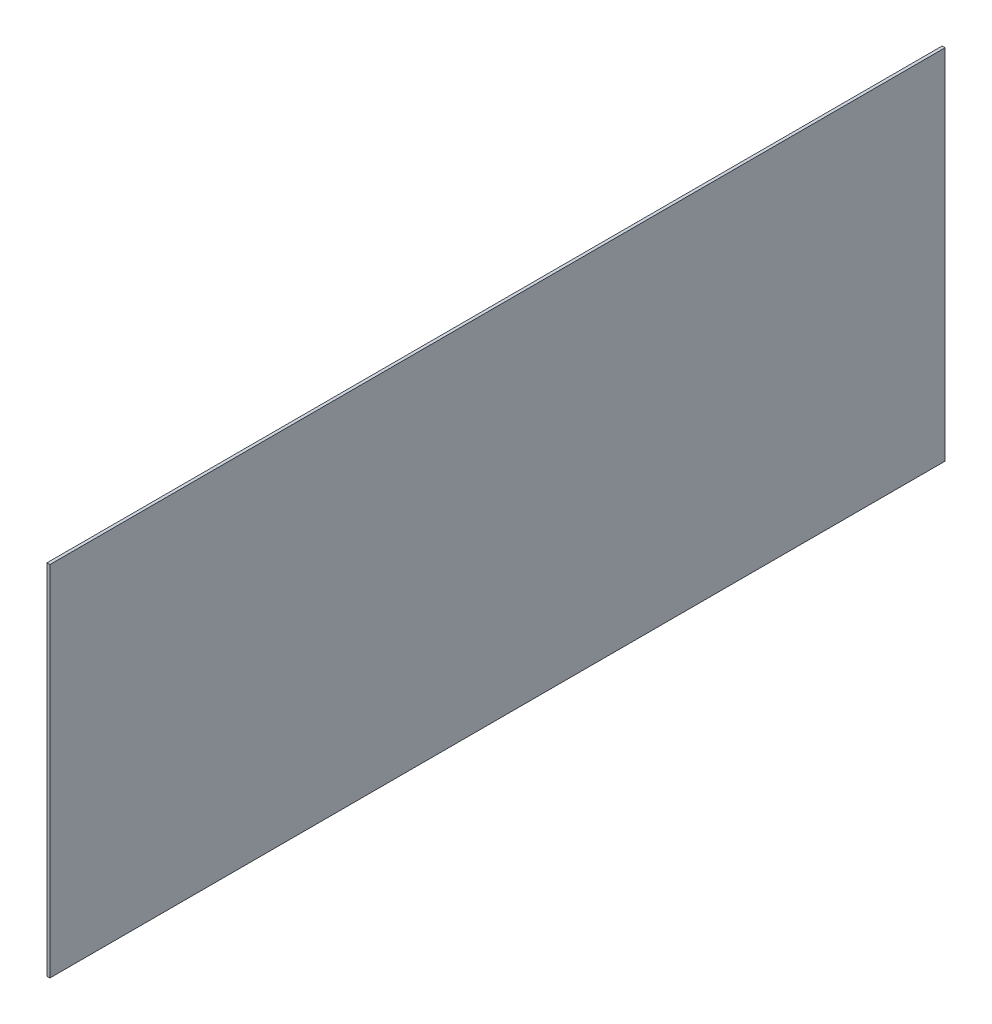
ISO-10303-21;
HEADER;
FILE_DESCRIPTION(('STEP AP214'),'2;1');
FILE_NAME('part.step','',(''),(''),'','','');
FILE_SCHEMA(('AUTOMOTIVE_DESIGN { 1 0 10303 214 1 1 1 1 }'));
ENDSEC;
DATA;
#1=APPLICATION_CONTEXT('core data for automotive mechanical design processes');
#2=APPLICATION_PROTOCOL_DEFINITION('international standard','automotive_design',2000,#1);
#3=PRODUCT_CONTEXT('',#1,'mechanical');
#4=PRODUCT('Part','Part','',(#3));
#5=PRODUCT_RELATED_PRODUCT_CATEGORY('part','',(#4));
#6=PRODUCT_DEFINITION_FORMATION('','',#4);
#7=PRODUCT_DEFINITION_CONTEXT('part definition',#1,'design');
#8=PRODUCT_DEFINITION('design','',#6,#7);
#9=PRODUCT_DEFINITION_SHAPE('','',#8);
#10=(LENGTH_UNIT() NAMED_UNIT(*) SI_UNIT(.MILLI.,.METRE.));
#11=(NAMED_UNIT(*) PLANE_ANGLE_UNIT() SI_UNIT($,.RADIAN.));
#12=(NAMED_UNIT(*) SI_UNIT($,.STERADIAN.) SOLID_ANGLE_UNIT());
#13=UNCERTAINTY_MEASURE_WITH_UNIT(LENGTH_MEASURE(1.E-05),#10,'distance_accuracy_value','');
#14=(GEOMETRIC_REPRESENTATION_CONTEXT(3) GLOBAL_UNCERTAINTY_ASSIGNED_CONTEXT((#13)) GLOBAL_UNIT_ASSIGNED_CONTEXT((#10,
#11,#12)) REPRESENTATION_CONTEXT('',''));
#15=CARTESIAN_POINT('',(0.,0.,0.));
#16=DIRECTION('',(0.,0.,1.));
#17=DIRECTION('',(1.,0.,0.));
#18=AXIS2_PLACEMENT_3D('',#15,#16,#17);
#19=CARTESIAN_POINT('',(-126.,-60.,150.));
#20=DIRECTION('',(0.,0.,1.));
#21=DIRECTION('',(0.,-1.,0.));
#22=AXIS2_PLACEMENT_3D('',#19,#20,#21);
#23=PLANE('',#22);
#24=DIRECTION('',(0.,-1.,0.));
#25=VECTOR('',#24,1.);
#26=CARTESIAN_POINT('',(-125.,-60.,150.));
#27=LINE('',#26,#25);
#28=CARTESIAN_POINT('',(-125.,60.,150.));
#29=VERTEX_POINT('',#28);
#30=CARTESIAN_POINT('',(-125.,-60.,150.));
#31=VERTEX_POINT('',#30);
#32=EDGE_CURVE('E115',#29,#31,#27,.T.);
#33=ORIENTED_EDGE('',*,*,#32,.F.);
#34=DIRECTION('',(1.,0.,0.));
#35=VECTOR('',#34,1.);
#36=CARTESIAN_POINT('',(-126.,60.,150.));
#37=LINE('',#36,#35);
#38=CARTESIAN_POINT('',(-126.,60.,150.));
#39=VERTEX_POINT('',#38);
#40=EDGE_CURVE('E11',#39,#29,#37,.T.);
#41=ORIENTED_EDGE('',*,*,#40,.F.);
#42=DIRECTION('',(0.,-1.,0.));
#43=VECTOR('',#42,1.);
#44=CARTESIAN_POINT('',(-126.,-60.,150.));
#45=LINE('',#44,#43);
#46=CARTESIAN_POINT('',(-126.,-60.,150.));
#47=VERTEX_POINT('',#46);
#48=EDGE_CURVE('E107',#39,#47,#45,.T.);
#49=ORIENTED_EDGE('',*,*,#48,.T.);
#50=DIRECTION('',(1.,0.,0.));
#51=VECTOR('',#50,1.);
#52=CARTESIAN_POINT('',(-126.,-60.,150.));
#53=LINE('',#52,#51);
#54=EDGE_CURVE('E48',#47,#31,#53,.T.);
#55=ORIENTED_EDGE('',*,*,#54,.T.);
#56=EDGE_LOOP('',(#33,#41,#49,#55));
#57=FACE_BOUND('',#56,.T.);
#58=ADVANCED_FACE('F45',(#57),#23,.T.);
#59=CARTESIAN_POINT('',(-126.,60.,150.));
#60=DIRECTION('',(0.,1.,0.));
#61=DIRECTION('',(0.,0.,1.));
#62=AXIS2_PLACEMENT_3D('',#59,#60,#61);
#63=PLANE('',#62);
#64=DIRECTION('',(0.,0.,1.));
#65=VECTOR('',#64,1.);
#66=CARTESIAN_POINT('',(-125.,60.,150.));
#67=LINE('',#66,#65);
#68=CARTESIAN_POINT('',(-125.,60.,-150.));
#69=VERTEX_POINT('',#68);
#70=EDGE_CURVE('E110',#69,#29,#67,.T.);
#71=ORIENTED_EDGE('',*,*,#70,.F.);
#72=DIRECTION('',(1.,0.,0.));
#73=VECTOR('',#72,1.);
#74=CARTESIAN_POINT('',(-126.,60.,-150.));
#75=LINE('',#74,#73);
#76=CARTESIAN_POINT('',(-126.,60.,-150.));
#77=VERTEX_POINT('',#76);
#78=EDGE_CURVE('E55',#77,#69,#75,.T.);
#79=ORIENTED_EDGE('',*,*,#78,.F.);
#80=DIRECTION('',(0.,0.,1.));
#81=VECTOR('',#80,1.);
#82=CARTESIAN_POINT('',(-126.,60.,150.));
#83=LINE('',#82,#81);
#84=EDGE_CURVE('E102',#77,#39,#83,.T.);
#85=ORIENTED_EDGE('',*,*,#84,.T.);
#86=ORIENTED_EDGE('',*,*,#40,.T.);
#87=EDGE_LOOP('',(#71,#79,#85,#86));
#88=FACE_BOUND('',#87,.T.);
#89=ADVANCED_FACE('F131',(#88),#63,.T.);
#90=CARTESIAN_POINT('',(-126.,-60.,-150.));
#91=DIRECTION('',(0.,0.,-1.));
#92=DIRECTION('',(0.,1.,0.));
#93=AXIS2_PLACEMENT_3D('',#90,#91,#92);
#94=PLANE('',#93);
#95=DIRECTION('',(0.,1.,0.));
#96=VECTOR('',#95,1.);
#97=CARTESIAN_POINT('',(-125.,-60.,-150.));
#98=LINE('',#97,#96);
#99=CARTESIAN_POINT('',(-125.,-60.,-150.));
#100=VERTEX_POINT('',#99);
#101=EDGE_CURVE('E96',#100,#69,#98,.T.);
#102=ORIENTED_EDGE('',*,*,#101,.F.);
#103=DIRECTION('',(1.,0.,0.));
#104=VECTOR('',#103,1.);
#105=CARTESIAN_POINT('',(-126.,-60.,-150.));
#106=LINE('',#105,#104);
#107=CARTESIAN_POINT('',(-126.,-60.,-150.));
#108=VERTEX_POINT('',#107);
#109=EDGE_CURVE('E91',#108,#100,#106,.T.);
#110=ORIENTED_EDGE('',*,*,#109,.F.);
#111=DIRECTION('',(0.,1.,0.));
#112=VECTOR('',#111,1.);
#113=CARTESIAN_POINT('',(-126.,-60.,-150.));
#114=LINE('',#113,#112);
#115=EDGE_CURVE('E94',#108,#77,#114,.T.);
#116=ORIENTED_EDGE('',*,*,#115,.T.);
#117=ORIENTED_EDGE('',*,*,#78,.T.);
#118=EDGE_LOOP('',(#102,#110,#116,#117));
#119=FACE_BOUND('',#118,.T.);
#120=ADVANCED_FACE('F93',(#119),#94,.T.);
#121=CARTESIAN_POINT('',(-126.,-60.,150.));
#122=DIRECTION('',(0.,-1.,0.));
#123=DIRECTION('',(0.,0.,-1.));
#124=AXIS2_PLACEMENT_3D('',#121,#122,#123);
#125=PLANE('',#124);
#126=DIRECTION('',(0.,0.,-1.));
#127=VECTOR('',#126,1.);
#128=CARTESIAN_POINT('',(-125.,-60.,150.));
#129=LINE('',#128,#127);
#130=EDGE_CURVE('E119',#31,#100,#129,.T.);
#131=ORIENTED_EDGE('',*,*,#130,.F.);
#132=ORIENTED_EDGE('',*,*,#54,.F.);
#133=DIRECTION('',(0.,0.,-1.));
#134=VECTOR('',#133,1.);
#135=CARTESIAN_POINT('',(-126.,-60.,150.));
#136=LINE('',#135,#134);
#137=EDGE_CURVE('E101',#47,#108,#136,.T.);
#138=ORIENTED_EDGE('',*,*,#137,.T.);
#139=ORIENTED_EDGE('',*,*,#109,.T.);
#140=EDGE_LOOP('',(#131,#132,#138,#139));
#141=FACE_BOUND('',#140,.T.);
#142=ADVANCED_FACE('F105',(#141),#125,.T.);
#143=CARTESIAN_POINT('',(-126.,0.,0.));
#144=DIRECTION('',(-1.,0.,0.));
#145=DIRECTION('',(0.,0.,1.));
#146=AXIS2_PLACEMENT_3D('',#143,#144,#145);
#147=PLANE('',#146);
#148=ORIENTED_EDGE('',*,*,#48,.F.);
#149=ORIENTED_EDGE('',*,*,#84,.F.);
#150=ORIENTED_EDGE('',*,*,#115,.F.);
#151=ORIENTED_EDGE('',*,*,#137,.F.);
#152=EDGE_LOOP('',(#148,#149,#150,#151));
#153=FACE_BOUND('',#152,.T.);
#154=ADVANCED_FACE('F100',(#153),#147,.T.);
#155=CARTESIAN_POINT('',(-125.,0.,0.));
#156=DIRECTION('',(-1.,0.,0.));
#157=DIRECTION('',(0.,0.,1.));
#158=AXIS2_PLACEMENT_3D('',#155,#156,#157);
#159=PLANE('',#158);
#160=ORIENTED_EDGE('',*,*,#32,.T.);
#161=ORIENTED_EDGE('',*,*,#130,.T.);
#162=ORIENTED_EDGE('',*,*,#101,.T.);
#163=ORIENTED_EDGE('',*,*,#70,.T.);
#164=EDGE_LOOP('',(#160,#161,#162,#163));
#165=FACE_BOUND('',#164,.T.);
#166=ADVANCED_FACE('F130',(#165),#159,.F.);
#167=CLOSED_SHELL('',(#58,#89,#120,#142,#154,#166));
#168=MANIFOLD_SOLID_BREP('B2',#167);
#169=ADVANCED_BREP_SHAPE_REPRESENTATION('',(#18,#168),#14);
#170=SHAPE_DEFINITION_REPRESENTATION(#9,#169);
ENDSEC;
END-ISO-10303-21;
